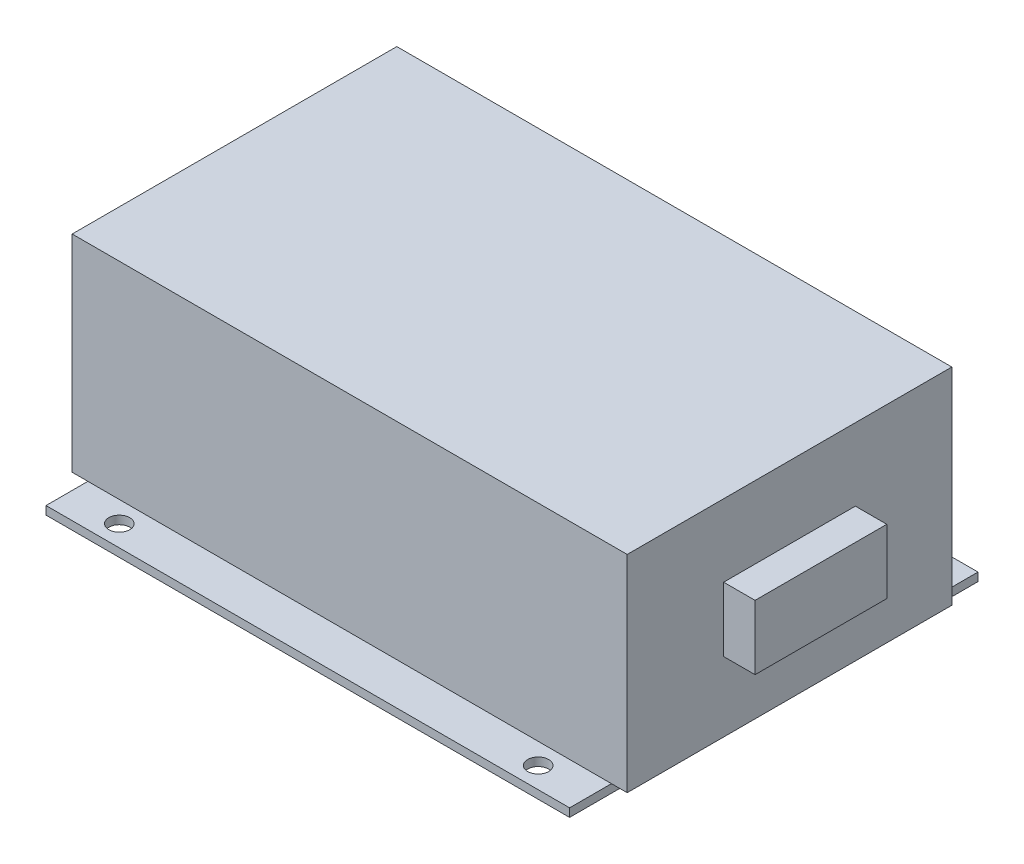
ISO-10303-21;
HEADER;
FILE_DESCRIPTION(('STEP AP214'),'2;1');
FILE_NAME('part.step','',(''),(''),'','','');
FILE_SCHEMA(('AUTOMOTIVE_DESIGN { 1 0 10303 214 1 1 1 1 }'));
ENDSEC;
DATA;
#1=APPLICATION_CONTEXT('core data for automotive mechanical design processes');
#2=APPLICATION_PROTOCOL_DEFINITION('international standard','automotive_design',2000,#1);
#3=PRODUCT_CONTEXT('',#1,'mechanical');
#4=PRODUCT('Part','Part','',(#3));
#5=PRODUCT_RELATED_PRODUCT_CATEGORY('part','',(#4));
#6=PRODUCT_DEFINITION_FORMATION('','',#4);
#7=PRODUCT_DEFINITION_CONTEXT('part definition',#1,'design');
#8=PRODUCT_DEFINITION('design','',#6,#7);
#9=PRODUCT_DEFINITION_SHAPE('','',#8);
#10=(LENGTH_UNIT() NAMED_UNIT(*) SI_UNIT(.MILLI.,.METRE.));
#11=(NAMED_UNIT(*) PLANE_ANGLE_UNIT() SI_UNIT($,.RADIAN.));
#12=(NAMED_UNIT(*) SI_UNIT($,.STERADIAN.) SOLID_ANGLE_UNIT());
#13=UNCERTAINTY_MEASURE_WITH_UNIT(LENGTH_MEASURE(1.E-05),#10,'distance_accuracy_value','');
#14=(GEOMETRIC_REPRESENTATION_CONTEXT(3) GLOBAL_UNCERTAINTY_ASSIGNED_CONTEXT((#13)) GLOBAL_UNIT_ASSIGNED_CONTEXT((#10,
#11,#12)) REPRESENTATION_CONTEXT('',''));
#15=CARTESIAN_POINT('',(0.,0.,0.));
#16=DIRECTION('',(0.,0.,1.));
#17=DIRECTION('',(1.,0.,0.));
#18=AXIS2_PLACEMENT_3D('',#15,#16,#17);
#19=CARTESIAN_POINT('',(53.,41.,31.));
#20=DIRECTION('',(-1.,0.,0.));
#21=DIRECTION('',(0.,0.,1.));
#22=AXIS2_PLACEMENT_3D('',#19,#20,#21);
#23=PLANE('',#22);
#24=DIRECTION('',(0.,0.,-1.));
#25=VECTOR('',#24,1.);
#26=CARTESIAN_POINT('',(53.,1.5875,31.));
#27=LINE('',#26,#25);
#28=CARTESIAN_POINT('',(53.,1.5875,31.));
#29=VERTEX_POINT('',#28);
#30=CARTESIAN_POINT('',(53.,1.5875,-31.));
#31=VERTEX_POINT('',#30);
#32=EDGE_CURVE('E158',#29,#31,#27,.T.);
#33=ORIENTED_EDGE('',*,*,#32,.T.);
#34=DIRECTION('',(0.,-1.,0.));
#35=VECTOR('',#34,1.);
#36=CARTESIAN_POINT('',(53.,41.,-31.));
#37=LINE('',#36,#35);
#38=CARTESIAN_POINT('',(53.,41.,-31.));
#39=VERTEX_POINT('',#38);
#40=EDGE_CURVE('E191',#39,#31,#37,.T.);
#41=ORIENTED_EDGE('',*,*,#40,.F.);
#42=DIRECTION('',(0.,0.,-1.));
#43=VECTOR('',#42,1.);
#44=CARTESIAN_POINT('',(53.,41.,31.));
#45=LINE('',#44,#43);
#46=CARTESIAN_POINT('',(53.,41.,31.));
#47=VERTEX_POINT('',#46);
#48=EDGE_CURVE('E167',#47,#39,#45,.T.);
#49=ORIENTED_EDGE('',*,*,#48,.F.);
#50=DIRECTION('',(0.,-1.,0.));
#51=VECTOR('',#50,1.);
#52=CARTESIAN_POINT('',(53.,41.,31.));
#53=LINE('',#52,#51);
#54=EDGE_CURVE('E175',#47,#29,#53,.T.);
#55=ORIENTED_EDGE('',*,*,#54,.T.);
#56=EDGE_LOOP('',(#33,#41,#49,#55));
#57=FACE_BOUND('',#56,.T.);
#58=DIRECTION('',(0.,1.,0.));
#59=VECTOR('',#58,1.);
#60=CARTESIAN_POINT('',(53.,27.1966098946059,-12.5784051962068));
#61=LINE('',#60,#59);
#62=CARTESIAN_POINT('',(53.,14.8999110587518,-12.5784051962068));
#63=VERTEX_POINT('',#62);
#64=CARTESIAN_POINT('',(53.,27.1966098946059,-12.5784051962068));
#65=VERTEX_POINT('',#64);
#66=EDGE_CURVE('E157',#63,#65,#61,.T.);
#67=ORIENTED_EDGE('',*,*,#66,.F.);
#68=DIRECTION('',(0.,0.,-1.));
#69=VECTOR('',#68,1.);
#70=CARTESIAN_POINT('',(53.,14.8999110587518,12.5784051962068));
#71=LINE('',#70,#69);
#72=CARTESIAN_POINT('',(53.,14.8999110587518,12.5784051962068));
#73=VERTEX_POINT('',#72);
#74=EDGE_CURVE('E154',#73,#63,#71,.T.);
#75=ORIENTED_EDGE('',*,*,#74,.F.);
#76=DIRECTION('',(0.,-1.,0.));
#77=VECTOR('',#76,1.);
#78=CARTESIAN_POINT('',(53.,27.1966098946059,12.5784051962068));
#79=LINE('',#78,#77);
#80=CARTESIAN_POINT('',(53.,27.1966098946059,12.5784051962068));
#81=VERTEX_POINT('',#80);
#82=EDGE_CURVE('E56',#81,#73,#79,.T.);
#83=ORIENTED_EDGE('',*,*,#82,.F.);
#84=DIRECTION('',(0.,0.,1.));
#85=VECTOR('',#84,1.);
#86=CARTESIAN_POINT('',(53.,27.1966098946059,12.5784051962068));
#87=LINE('',#86,#85);
#88=EDGE_CURVE('E51',#65,#81,#87,.T.);
#89=ORIENTED_EDGE('',*,*,#88,.F.);
#90=EDGE_LOOP('',(#67,#75,#83,#89));
#91=FACE_BOUND('',#90,.T.);
#92=ADVANCED_FACE('F32',(#57,#91),#23,.F.);
#93=CARTESIAN_POINT('',(50.,1.5875,-39.));
#94=DIRECTION('',(0.,-1.,0.));
#95=DIRECTION('',(0.,0.,-1.));
#96=AXIS2_PLACEMENT_3D('',#93,#94,#95);
#97=PLANE('',#96);
#98=CARTESIAN_POINT('',(40.,1.5875,35.));
#99=DIRECTION('',(0.,1.,0.));
#100=DIRECTION('',(0.,0.,1.));
#101=AXIS2_PLACEMENT_3D('',#98,#99,#100);
#102=CIRCLE('',#101,2.);
#103=CARTESIAN_POINT('',(40.,1.5875,37.));
#104=VERTEX_POINT('',#103);
#105=EDGE_CURVE('E195',#104,#104,#102,.T.);
#106=ORIENTED_EDGE('',*,*,#105,.F.);
#107=EDGE_LOOP('',(#106));
#108=FACE_BOUND('',#107,.T.);
#109=CARTESIAN_POINT('',(-40.,1.5875,35.));
#110=DIRECTION('',(0.,1.,0.));
#111=DIRECTION('',(0.,0.,1.));
#112=AXIS2_PLACEMENT_3D('',#109,#110,#111);
#113=CIRCLE('',#112,2.);
#114=CARTESIAN_POINT('',(-40.,1.5875,37.));
#115=VERTEX_POINT('',#114);
#116=EDGE_CURVE('E201',#115,#115,#113,.T.);
#117=ORIENTED_EDGE('',*,*,#116,.F.);
#118=EDGE_LOOP('',(#117));
#119=FACE_BOUND('',#118,.T.);
#120=DIRECTION('',(1.,0.,0.));
#121=VECTOR('',#120,1.);
#122=CARTESIAN_POINT('',(-53.,1.5875,31.));
#123=LINE('',#122,#121);
#124=CARTESIAN_POINT('',(-50.,1.5875,31.));
#125=VERTEX_POINT('',#124);
#126=CARTESIAN_POINT('',(50.,1.5875,31.));
#127=VERTEX_POINT('',#126);
#128=EDGE_CURVE('E11',#125,#127,#123,.T.);
#129=ORIENTED_EDGE('',*,*,#128,.F.);
#130=DIRECTION('',(0.,0.,1.));
#131=VECTOR('',#130,1.);
#132=CARTESIAN_POINT('',(-50.,1.5875,39.));
#133=LINE('',#132,#131);
#134=CARTESIAN_POINT('',(-50.,1.5875,39.));
#135=VERTEX_POINT('',#134);
#136=EDGE_CURVE('E226',#125,#135,#133,.T.);
#137=ORIENTED_EDGE('',*,*,#136,.T.);
#138=DIRECTION('',(1.,0.,0.));
#139=VECTOR('',#138,1.);
#140=CARTESIAN_POINT('',(-50.,1.5875,39.));
#141=LINE('',#140,#139);
#142=CARTESIAN_POINT('',(50.,1.5875,39.));
#143=VERTEX_POINT('',#142);
#144=EDGE_CURVE('E229',#135,#143,#141,.T.);
#145=ORIENTED_EDGE('',*,*,#144,.T.);
#146=DIRECTION('',(0.,0.,-1.));
#147=VECTOR('',#146,1.);
#148=CARTESIAN_POINT('',(50.,1.5875,39.));
#149=LINE('',#148,#147);
#150=EDGE_CURVE('E219',#143,#127,#149,.T.);
#151=ORIENTED_EDGE('',*,*,#150,.T.);
#152=EDGE_LOOP('',(#129,#137,#145,#151));
#153=FACE_BOUND('',#152,.T.);
#154=ADVANCED_FACE('F303',(#108,#119,#153),#97,.F.);
#155=CARTESIAN_POINT('',(40.,1.5875,-35.));
#156=DIRECTION('',(0.,1.,0.));
#157=DIRECTION('',(0.,0.,1.));
#158=AXIS2_PLACEMENT_3D('',#155,#156,#157);
#159=CIRCLE('',#158,2.);
#160=CARTESIAN_POINT('',(40.,1.5875,-33.));
#161=VERTEX_POINT('',#160);
#162=EDGE_CURVE('E207',#161,#161,#159,.T.);
#163=ORIENTED_EDGE('',*,*,#162,.F.);
#164=EDGE_LOOP('',(#163));
#165=FACE_BOUND('',#164,.T.);
#166=CARTESIAN_POINT('',(-40.,1.5875,-35.));
#167=DIRECTION('',(0.,1.,0.));
#168=DIRECTION('',(0.,0.,1.));
#169=AXIS2_PLACEMENT_3D('',#166,#167,#168);
#170=CIRCLE('',#169,2.);
#171=CARTESIAN_POINT('',(-40.,1.5875,-33.));
#172=VERTEX_POINT('',#171);
#173=EDGE_CURVE('E213',#172,#172,#170,.T.);
#174=ORIENTED_EDGE('',*,*,#173,.F.);
#175=EDGE_LOOP('',(#174));
#176=FACE_BOUND('',#175,.T.);
#177=DIRECTION('',(-1.,0.,0.));
#178=VECTOR('',#177,1.);
#179=CARTESIAN_POINT('',(-53.,1.5875,-31.));
#180=LINE('',#179,#178);
#181=CARTESIAN_POINT('',(50.,1.5875,-31.));
#182=VERTEX_POINT('',#181);
#183=CARTESIAN_POINT('',(-50.,1.5875,-31.));
#184=VERTEX_POINT('',#183);
#185=EDGE_CURVE('E41',#182,#184,#180,.T.);
#186=ORIENTED_EDGE('',*,*,#185,.F.);
#187=CARTESIAN_POINT('',(50.,1.5875,-39.));
#188=VERTEX_POINT('',#187);
#189=EDGE_CURVE('E224',#182,#188,#149,.T.);
#190=ORIENTED_EDGE('',*,*,#189,.T.);
#191=DIRECTION('',(-1.,0.,0.));
#192=VECTOR('',#191,1.);
#193=CARTESIAN_POINT('',(-50.,1.5875,-39.));
#194=LINE('',#193,#192);
#195=CARTESIAN_POINT('',(-50.,1.5875,-39.));
#196=VERTEX_POINT('',#195);
#197=EDGE_CURVE('E222',#188,#196,#194,.T.);
#198=ORIENTED_EDGE('',*,*,#197,.T.);
#199=EDGE_CURVE('E227',#196,#184,#133,.T.);
#200=ORIENTED_EDGE('',*,*,#199,.T.);
#201=EDGE_LOOP('',(#186,#190,#198,#200));
#202=FACE_BOUND('',#201,.T.);
#203=ADVANCED_FACE('F288',(#165,#176,#202),#97,.F.);
#204=CARTESIAN_POINT('',(50.,0.,-39.));
#205=DIRECTION('',(0.,-1.,0.));
#206=DIRECTION('',(0.,0.,-1.));
#207=AXIS2_PLACEMENT_3D('',#204,#205,#206);
#208=PLANE('',#207);
#209=CARTESIAN_POINT('',(-40.,0.,35.));
#210=DIRECTION('',(0.,1.,0.));
#211=DIRECTION('',(0.,0.,1.));
#212=AXIS2_PLACEMENT_3D('',#209,#210,#211);
#213=CIRCLE('',#212,2.);
#214=CARTESIAN_POINT('',(-40.,0.,37.));
#215=VERTEX_POINT('',#214);
#216=EDGE_CURVE('E198',#215,#215,#213,.T.);
#217=ORIENTED_EDGE('',*,*,#216,.T.);
#218=EDGE_LOOP('',(#217));
#219=FACE_BOUND('',#218,.T.);
#220=CARTESIAN_POINT('',(-40.,0.,-35.));
#221=DIRECTION('',(0.,1.,0.));
#222=DIRECTION('',(0.,0.,1.));
#223=AXIS2_PLACEMENT_3D('',#220,#221,#222);
#224=CIRCLE('',#223,2.);
#225=CARTESIAN_POINT('',(-40.,0.,-33.));
#226=VERTEX_POINT('',#225);
#227=EDGE_CURVE('E210',#226,#226,#224,.T.);
#228=ORIENTED_EDGE('',*,*,#227,.T.);
#229=EDGE_LOOP('',(#228));
#230=FACE_BOUND('',#229,.T.);
#231=DIRECTION('',(0.,0.,-1.));
#232=VECTOR('',#231,1.);
#233=CARTESIAN_POINT('',(50.,0.,39.));
#234=LINE('',#233,#232);
#235=CARTESIAN_POINT('',(50.,0.,39.));
#236=VERTEX_POINT('',#235);
#237=CARTESIAN_POINT('',(50.,0.,-39.));
#238=VERTEX_POINT('',#237);
#239=EDGE_CURVE('E216',#236,#238,#234,.T.);
#240=ORIENTED_EDGE('',*,*,#239,.F.);
#241=DIRECTION('',(1.,0.,0.));
#242=VECTOR('',#241,1.);
#243=CARTESIAN_POINT('',(-50.,0.,39.));
#244=LINE('',#243,#242);
#245=CARTESIAN_POINT('',(-50.,0.,39.));
#246=VERTEX_POINT('',#245);
#247=EDGE_CURVE('E239',#246,#236,#244,.T.);
#248=ORIENTED_EDGE('',*,*,#247,.F.);
#249=DIRECTION('',(0.,0.,1.));
#250=VECTOR('',#249,1.);
#251=CARTESIAN_POINT('',(-50.,0.,39.));
#252=LINE('',#251,#250);
#253=CARTESIAN_POINT('',(-50.,0.,-39.));
#254=VERTEX_POINT('',#253);
#255=EDGE_CURVE('E237',#254,#246,#252,.T.);
#256=ORIENTED_EDGE('',*,*,#255,.F.);
#257=DIRECTION('',(-1.,0.,0.));
#258=VECTOR('',#257,1.);
#259=CARTESIAN_POINT('',(-50.,0.,-39.));
#260=LINE('',#259,#258);
#261=EDGE_CURVE('E235',#238,#254,#260,.T.);
#262=ORIENTED_EDGE('',*,*,#261,.F.);
#263=EDGE_LOOP('',(#240,#248,#256,#262));
#264=FACE_BOUND('',#263,.T.);
#265=CARTESIAN_POINT('',(40.,0.,-35.));
#266=DIRECTION('',(0.,1.,0.));
#267=DIRECTION('',(0.,0.,1.));
#268=AXIS2_PLACEMENT_3D('',#265,#266,#267);
#269=CIRCLE('',#268,2.);
#270=CARTESIAN_POINT('',(40.,0.,-33.));
#271=VERTEX_POINT('',#270);
#272=EDGE_CURVE('E204',#271,#271,#269,.T.);
#273=ORIENTED_EDGE('',*,*,#272,.T.);
#274=EDGE_LOOP('',(#273));
#275=FACE_BOUND('',#274,.T.);
#276=CARTESIAN_POINT('',(40.,0.,35.));
#277=DIRECTION('',(0.,1.,0.));
#278=DIRECTION('',(0.,0.,1.));
#279=AXIS2_PLACEMENT_3D('',#276,#277,#278);
#280=CIRCLE('',#279,2.);
#281=CARTESIAN_POINT('',(40.,0.,37.));
#282=VERTEX_POINT('',#281);
#283=EDGE_CURVE('E194',#282,#282,#280,.T.);
#284=ORIENTED_EDGE('',*,*,#283,.T.);
#285=EDGE_LOOP('',(#284));
#286=FACE_BOUND('',#285,.T.);
#287=ADVANCED_FACE('F294',(#219,#230,#264,#275,#286),#208,.T.);
#288=CARTESIAN_POINT('',(50.,1.5875,39.));
#289=DIRECTION('',(-1.,0.,0.));
#290=DIRECTION('',(0.,0.,1.));
#291=AXIS2_PLACEMENT_3D('',#288,#289,#290);
#292=PLANE('',#291);
#293=ORIENTED_EDGE('',*,*,#239,.T.);
#294=DIRECTION('',(0.,-1.,0.));
#295=VECTOR('',#294,1.);
#296=CARTESIAN_POINT('',(50.,1.5875,-39.));
#297=LINE('',#296,#295);
#298=EDGE_CURVE('E36',#188,#238,#297,.T.);
#299=ORIENTED_EDGE('',*,*,#298,.F.);
#300=ORIENTED_EDGE('',*,*,#189,.F.);
#301=EDGE_CURVE('E223',#127,#182,#149,.T.);
#302=ORIENTED_EDGE('',*,*,#301,.F.);
#303=ORIENTED_EDGE('',*,*,#150,.F.);
#304=DIRECTION('',(0.,-1.,0.));
#305=VECTOR('',#304,1.);
#306=CARTESIAN_POINT('',(50.,1.5875,39.));
#307=LINE('',#306,#305);
#308=EDGE_CURVE('E232',#143,#236,#307,.T.);
#309=ORIENTED_EDGE('',*,*,#308,.T.);
#310=EDGE_LOOP('',(#293,#299,#300,#302,#303,#309));
#311=FACE_BOUND('',#310,.T.);
#312=ADVANCED_FACE('F34',(#311),#292,.F.);
#313=CARTESIAN_POINT('',(-50.,1.5875,-39.));
#314=DIRECTION('',(0.,0.,1.));
#315=DIRECTION('',(1.,0.,0.));
#316=AXIS2_PLACEMENT_3D('',#313,#314,#315);
#317=PLANE('',#316);
#318=ORIENTED_EDGE('',*,*,#261,.T.);
#319=DIRECTION('',(0.,-1.,0.));
#320=VECTOR('',#319,1.);
#321=CARTESIAN_POINT('',(-50.,1.5875,-39.));
#322=LINE('',#321,#320);
#323=EDGE_CURVE('E245',#196,#254,#322,.T.);
#324=ORIENTED_EDGE('',*,*,#323,.F.);
#325=ORIENTED_EDGE('',*,*,#197,.F.);
#326=ORIENTED_EDGE('',*,*,#298,.T.);
#327=EDGE_LOOP('',(#318,#324,#325,#326));
#328=FACE_BOUND('',#327,.T.);
#329=ADVANCED_FACE('F289',(#328),#317,.F.);
#330=CARTESIAN_POINT('',(-50.,1.5875,39.));
#331=DIRECTION('',(1.,0.,0.));
#332=DIRECTION('',(0.,0.,-1.));
#333=AXIS2_PLACEMENT_3D('',#330,#331,#332);
#334=PLANE('',#333);
#335=ORIENTED_EDGE('',*,*,#255,.T.);
#336=DIRECTION('',(0.,-1.,0.));
#337=VECTOR('',#336,1.);
#338=CARTESIAN_POINT('',(-50.,1.5875,39.));
#339=LINE('',#338,#337);
#340=EDGE_CURVE('E243',#135,#246,#339,.T.);
#341=ORIENTED_EDGE('',*,*,#340,.F.);
#342=ORIENTED_EDGE('',*,*,#136,.F.);
#343=EDGE_CURVE('E230',#184,#125,#133,.T.);
#344=ORIENTED_EDGE('',*,*,#343,.F.);
#345=ORIENTED_EDGE('',*,*,#199,.F.);
#346=ORIENTED_EDGE('',*,*,#323,.T.);
#347=EDGE_LOOP('',(#335,#341,#342,#344,#345,#346));
#348=FACE_BOUND('',#347,.T.);
#349=ADVANCED_FACE('F297',(#348),#334,.F.);
#350=CARTESIAN_POINT('',(-50.,1.5875,39.));
#351=DIRECTION('',(0.,0.,-1.));
#352=DIRECTION('',(-1.,0.,0.));
#353=AXIS2_PLACEMENT_3D('',#350,#351,#352);
#354=PLANE('',#353);
#355=ORIENTED_EDGE('',*,*,#247,.T.);
#356=ORIENTED_EDGE('',*,*,#308,.F.);
#357=ORIENTED_EDGE('',*,*,#144,.F.);
#358=ORIENTED_EDGE('',*,*,#340,.T.);
#359=EDGE_LOOP('',(#355,#356,#357,#358));
#360=FACE_BOUND('',#359,.T.);
#361=ADVANCED_FACE('F301',(#360),#354,.F.);
#362=CARTESIAN_POINT('',(-40.,1.5875,-35.));
#363=DIRECTION('',(0.,-1.,0.));
#364=DIRECTION('',(0.,0.,-1.));
#365=AXIS2_PLACEMENT_3D('',#362,#363,#364);
#366=CYLINDRICAL_SURFACE('',#365,2.);
#367=ORIENTED_EDGE('',*,*,#173,.T.);
#368=EDGE_LOOP('',(#367));
#369=FACE_BOUND('',#368,.T.);
#370=ORIENTED_EDGE('',*,*,#227,.F.);
#371=EDGE_LOOP('',(#370));
#372=FACE_BOUND('',#371,.T.);
#373=ADVANCED_FACE('F317',(#369,#372),#366,.F.);
#374=CARTESIAN_POINT('',(40.,1.5875,-35.));
#375=DIRECTION('',(0.,-1.,0.));
#376=DIRECTION('',(0.,0.,-1.));
#377=AXIS2_PLACEMENT_3D('',#374,#375,#376);
#378=CYLINDRICAL_SURFACE('',#377,2.);
#379=ORIENTED_EDGE('',*,*,#162,.T.);
#380=EDGE_LOOP('',(#379));
#381=FACE_BOUND('',#380,.T.);
#382=ORIENTED_EDGE('',*,*,#272,.F.);
#383=EDGE_LOOP('',(#382));
#384=FACE_BOUND('',#383,.T.);
#385=ADVANCED_FACE('F366',(#381,#384),#378,.F.);
#386=CARTESIAN_POINT('',(-40.,1.5875,35.));
#387=DIRECTION('',(0.,-1.,0.));
#388=DIRECTION('',(0.,0.,-1.));
#389=AXIS2_PLACEMENT_3D('',#386,#387,#388);
#390=CYLINDRICAL_SURFACE('',#389,2.);
#391=ORIENTED_EDGE('',*,*,#116,.T.);
#392=EDGE_LOOP('',(#391));
#393=FACE_BOUND('',#392,.T.);
#394=ORIENTED_EDGE('',*,*,#216,.F.);
#395=EDGE_LOOP('',(#394));
#396=FACE_BOUND('',#395,.T.);
#397=ADVANCED_FACE('F355',(#393,#396),#390,.F.);
#398=CARTESIAN_POINT('',(40.,1.5875,35.));
#399=DIRECTION('',(0.,-1.,0.));
#400=DIRECTION('',(0.,0.,-1.));
#401=AXIS2_PLACEMENT_3D('',#398,#399,#400);
#402=CYLINDRICAL_SURFACE('',#401,2.);
#403=ORIENTED_EDGE('',*,*,#105,.T.);
#404=EDGE_LOOP('',(#403));
#405=FACE_BOUND('',#404,.T.);
#406=ORIENTED_EDGE('',*,*,#283,.F.);
#407=EDGE_LOOP('',(#406));
#408=FACE_BOUND('',#407,.T.);
#409=ADVANCED_FACE('F351',(#405,#408),#402,.F.);
#410=CARTESIAN_POINT('',(53.,1.5875,-31.));
#411=DIRECTION('',(0.,-1.,0.));
#412=DIRECTION('',(0.,0.,-1.));
#413=AXIS2_PLACEMENT_3D('',#410,#411,#412);
#414=PLANE('',#413);
#415=EDGE_CURVE('E44',#127,#29,#123,.T.);
#416=ORIENTED_EDGE('',*,*,#415,.F.);
#417=ORIENTED_EDGE('',*,*,#301,.T.);
#418=EDGE_CURVE('E177',#31,#182,#180,.T.);
#419=ORIENTED_EDGE('',*,*,#418,.F.);
#420=ORIENTED_EDGE('',*,*,#32,.F.);
#421=EDGE_LOOP('',(#416,#417,#419,#420));
#422=FACE_BOUND('',#421,.T.);
#423=ADVANCED_FACE('F282',(#422),#414,.T.);
#424=CARTESIAN_POINT('',(-53.,41.,-31.));
#425=DIRECTION('',(0.,0.,1.));
#426=DIRECTION('',(1.,0.,0.));
#427=AXIS2_PLACEMENT_3D('',#424,#425,#426);
#428=PLANE('',#427);
#429=ORIENTED_EDGE('',*,*,#418,.T.);
#430=ORIENTED_EDGE('',*,*,#185,.T.);
#431=CARTESIAN_POINT('',(-53.,1.5875,-31.));
#432=VERTEX_POINT('',#431);
#433=EDGE_CURVE('E161',#184,#432,#180,.T.);
#434=ORIENTED_EDGE('',*,*,#433,.T.);
#435=DIRECTION('',(0.,-1.,0.));
#436=VECTOR('',#435,1.);
#437=CARTESIAN_POINT('',(-53.,41.,-31.));
#438=LINE('',#437,#436);
#439=CARTESIAN_POINT('',(-53.,41.,-31.));
#440=VERTEX_POINT('',#439);
#441=EDGE_CURVE('E188',#440,#432,#438,.T.);
#442=ORIENTED_EDGE('',*,*,#441,.F.);
#443=DIRECTION('',(-1.,0.,0.));
#444=VECTOR('',#443,1.);
#445=CARTESIAN_POINT('',(-53.,41.,-31.));
#446=LINE('',#445,#444);
#447=EDGE_CURVE('E170',#39,#440,#446,.T.);
#448=ORIENTED_EDGE('',*,*,#447,.F.);
#449=ORIENTED_EDGE('',*,*,#40,.T.);
#450=EDGE_LOOP('',(#429,#430,#434,#442,#448,#449));
#451=FACE_BOUND('',#450,.T.);
#452=ADVANCED_FACE('F259',(#451),#428,.F.);
#453=CARTESIAN_POINT('',(-53.,41.,31.));
#454=DIRECTION('',(1.,0.,0.));
#455=DIRECTION('',(0.,0.,-1.));
#456=AXIS2_PLACEMENT_3D('',#453,#454,#455);
#457=PLANE('',#456);
#458=DIRECTION('',(0.,0.,1.));
#459=VECTOR('',#458,1.);
#460=CARTESIAN_POINT('',(-53.,1.5875,31.));
#461=LINE('',#460,#459);
#462=CARTESIAN_POINT('',(-53.,1.5875,31.));
#463=VERTEX_POINT('',#462);
#464=EDGE_CURVE('E180',#432,#463,#461,.T.);
#465=ORIENTED_EDGE('',*,*,#464,.T.);
#466=DIRECTION('',(0.,-1.,0.));
#467=VECTOR('',#466,1.);
#468=CARTESIAN_POINT('',(-53.,41.,31.));
#469=LINE('',#468,#467);
#470=CARTESIAN_POINT('',(-53.,41.,31.));
#471=VERTEX_POINT('',#470);
#472=EDGE_CURVE('E185',#471,#463,#469,.T.);
#473=ORIENTED_EDGE('',*,*,#472,.F.);
#474=DIRECTION('',(0.,0.,1.));
#475=VECTOR('',#474,1.);
#476=CARTESIAN_POINT('',(-53.,41.,31.));
#477=LINE('',#476,#475);
#478=EDGE_CURVE('E172',#440,#471,#477,.T.);
#479=ORIENTED_EDGE('',*,*,#478,.F.);
#480=ORIENTED_EDGE('',*,*,#441,.T.);
#481=EDGE_LOOP('',(#465,#473,#479,#480));
#482=FACE_BOUND('',#481,.T.);
#483=ADVANCED_FACE('F265',(#482),#457,.F.);
#484=CARTESIAN_POINT('',(-53.,41.,31.));
#485=DIRECTION('',(0.,0.,-1.));
#486=DIRECTION('',(-1.,0.,0.));
#487=AXIS2_PLACEMENT_3D('',#484,#485,#486);
#488=PLANE('',#487);
#489=EDGE_CURVE('E43',#463,#125,#123,.T.);
#490=ORIENTED_EDGE('',*,*,#489,.T.);
#491=ORIENTED_EDGE('',*,*,#128,.T.);
#492=ORIENTED_EDGE('',*,*,#415,.T.);
#493=ORIENTED_EDGE('',*,*,#54,.F.);
#494=DIRECTION('',(1.,0.,0.));
#495=VECTOR('',#494,1.);
#496=CARTESIAN_POINT('',(-53.,41.,31.));
#497=LINE('',#496,#495);
#498=EDGE_CURVE('E174',#471,#47,#497,.T.);
#499=ORIENTED_EDGE('',*,*,#498,.F.);
#500=ORIENTED_EDGE('',*,*,#472,.T.);
#501=EDGE_LOOP('',(#490,#491,#492,#493,#499,#500));
#502=FACE_BOUND('',#501,.T.);
#503=ADVANCED_FACE('F271',(#502),#488,.F.);
#504=CARTESIAN_POINT('',(53.,41.,-31.));
#505=DIRECTION('',(0.,-1.,0.));
#506=DIRECTION('',(0.,0.,-1.));
#507=AXIS2_PLACEMENT_3D('',#504,#505,#506);
#508=PLANE('',#507);
#509=ORIENTED_EDGE('',*,*,#48,.T.);
#510=ORIENTED_EDGE('',*,*,#447,.T.);
#511=ORIENTED_EDGE('',*,*,#478,.T.);
#512=ORIENTED_EDGE('',*,*,#498,.T.);
#513=EDGE_LOOP('',(#509,#510,#511,#512));
#514=FACE_BOUND('',#513,.T.);
#515=ADVANCED_FACE('F276',(#514),#508,.F.);
#516=ORIENTED_EDGE('',*,*,#433,.F.);
#517=ORIENTED_EDGE('',*,*,#343,.T.);
#518=ORIENTED_EDGE('',*,*,#489,.F.);
#519=ORIENTED_EDGE('',*,*,#464,.F.);
#520=EDGE_LOOP('',(#516,#517,#518,#519));
#521=FACE_BOUND('',#520,.T.);
#522=ADVANCED_FACE('F268',(#521),#414,.T.);
#523=CARTESIAN_POINT('',(59.,27.1966098946059,-12.5784051962068));
#524=DIRECTION('',(0.,0.,1.));
#525=DIRECTION('',(1.,0.,0.));
#526=AXIS2_PLACEMENT_3D('',#523,#524,#525);
#527=PLANE('',#526);
#528=ORIENTED_EDGE('',*,*,#66,.T.);
#529=DIRECTION('',(-1.,0.,0.));
#530=VECTOR('',#529,1.);
#531=CARTESIAN_POINT('',(59.,27.1966098946059,-12.5784051962068));
#532=LINE('',#531,#530);
#533=CARTESIAN_POINT('',(59.,27.1966098946059,-12.5784051962068));
#534=VERTEX_POINT('',#533);
#535=EDGE_CURVE('E138',#534,#65,#532,.T.);
#536=ORIENTED_EDGE('',*,*,#535,.F.);
#537=DIRECTION('',(0.,1.,0.));
#538=VECTOR('',#537,1.);
#539=CARTESIAN_POINT('',(59.,27.1966098946059,-12.5784051962068));
#540=LINE('',#539,#538);
#541=CARTESIAN_POINT('',(59.,14.8999110587518,-12.5784051962068));
#542=VERTEX_POINT('',#541);
#543=EDGE_CURVE('E145',#542,#534,#540,.T.);
#544=ORIENTED_EDGE('',*,*,#543,.F.);
#545=DIRECTION('',(-1.,0.,0.));
#546=VECTOR('',#545,1.);
#547=CARTESIAN_POINT('',(59.,14.8999110587518,-12.5784051962068));
#548=LINE('',#547,#546);
#549=EDGE_CURVE('E501',#542,#63,#548,.T.);
#550=ORIENTED_EDGE('',*,*,#549,.T.);
#551=EDGE_LOOP('',(#528,#536,#544,#550));
#552=FACE_BOUND('',#551,.T.);
#553=ADVANCED_FACE('F156',(#552),#527,.F.);
#554=CARTESIAN_POINT('',(59.,27.1966098946059,12.5784051962068));
#555=DIRECTION('',(0.,-1.,0.));
#556=DIRECTION('',(0.,0.,-1.));
#557=AXIS2_PLACEMENT_3D('',#554,#555,#556);
#558=PLANE('',#557);
#559=ORIENTED_EDGE('',*,*,#88,.T.);
#560=DIRECTION('',(-1.,0.,0.));
#561=VECTOR('',#560,1.);
#562=CARTESIAN_POINT('',(59.,27.1966098946059,12.5784051962068));
#563=LINE('',#562,#561);
#564=CARTESIAN_POINT('',(59.,27.1966098946059,12.5784051962068));
#565=VERTEX_POINT('',#564);
#566=EDGE_CURVE('E141',#565,#81,#563,.T.);
#567=ORIENTED_EDGE('',*,*,#566,.F.);
#568=DIRECTION('',(0.,0.,1.));
#569=VECTOR('',#568,1.);
#570=CARTESIAN_POINT('',(59.,27.1966098946059,12.5784051962068));
#571=LINE('',#570,#569);
#572=EDGE_CURVE('E134',#534,#565,#571,.T.);
#573=ORIENTED_EDGE('',*,*,#572,.F.);
#574=ORIENTED_EDGE('',*,*,#535,.T.);
#575=EDGE_LOOP('',(#559,#567,#573,#574));
#576=FACE_BOUND('',#575,.T.);
#577=ADVANCED_FACE('F136',(#576),#558,.F.);
#578=CARTESIAN_POINT('',(59.,27.1966098946059,12.5784051962068));
#579=DIRECTION('',(0.,0.,-1.));
#580=DIRECTION('',(-1.,0.,0.));
#581=AXIS2_PLACEMENT_3D('',#578,#579,#580);
#582=PLANE('',#581);
#583=ORIENTED_EDGE('',*,*,#82,.T.);
#584=DIRECTION('',(-1.,0.,0.));
#585=VECTOR('',#584,1.);
#586=CARTESIAN_POINT('',(59.,14.8999110587518,12.5784051962068));
#587=LINE('',#586,#585);
#588=CARTESIAN_POINT('',(59.,14.8999110587518,12.5784051962068));
#589=VERTEX_POINT('',#588);
#590=EDGE_CURVE('E163',#589,#73,#587,.T.);
#591=ORIENTED_EDGE('',*,*,#590,.F.);
#592=DIRECTION('',(0.,-1.,0.));
#593=VECTOR('',#592,1.);
#594=CARTESIAN_POINT('',(59.,27.1966098946059,12.5784051962068));
#595=LINE('',#594,#593);
#596=EDGE_CURVE('E144',#565,#589,#595,.T.);
#597=ORIENTED_EDGE('',*,*,#596,.F.);
#598=ORIENTED_EDGE('',*,*,#566,.T.);
#599=EDGE_LOOP('',(#583,#591,#597,#598));
#600=FACE_BOUND('',#599,.T.);
#601=ADVANCED_FACE('F468',(#600),#582,.F.);
#602=CARTESIAN_POINT('',(59.,14.8999110587518,12.5784051962068));
#603=DIRECTION('',(0.,1.,0.));
#604=DIRECTION('',(0.,0.,1.));
#605=AXIS2_PLACEMENT_3D('',#602,#603,#604);
#606=PLANE('',#605);
#607=ORIENTED_EDGE('',*,*,#74,.T.);
#608=ORIENTED_EDGE('',*,*,#549,.F.);
#609=DIRECTION('',(0.,0.,-1.));
#610=VECTOR('',#609,1.);
#611=CARTESIAN_POINT('',(59.,14.8999110587518,12.5784051962068));
#612=LINE('',#611,#610);
#613=EDGE_CURVE('E150',#589,#542,#612,.T.);
#614=ORIENTED_EDGE('',*,*,#613,.F.);
#615=ORIENTED_EDGE('',*,*,#590,.T.);
#616=EDGE_LOOP('',(#607,#608,#614,#615));
#617=FACE_BOUND('',#616,.T.);
#618=ADVANCED_FACE('F477',(#617),#606,.F.);
#619=CARTESIAN_POINT('',(59.,14.8999110587518,-12.5784051962068));
#620=DIRECTION('',(1.,0.,0.));
#621=DIRECTION('',(0.,0.,-1.));
#622=AXIS2_PLACEMENT_3D('',#619,#620,#621);
#623=PLANE('',#622);
#624=ORIENTED_EDGE('',*,*,#543,.T.);
#625=ORIENTED_EDGE('',*,*,#572,.T.);
#626=ORIENTED_EDGE('',*,*,#596,.T.);
#627=ORIENTED_EDGE('',*,*,#613,.T.);
#628=EDGE_LOOP('',(#624,#625,#626,#627));
#629=FACE_BOUND('',#628,.T.);
#630=ADVANCED_FACE('F148',(#629),#623,.T.);
#631=CLOSED_SHELL('',(#92,#154,#203,#287,#312,#329,#349,#361,#373,#385,#397,#409,#423,#452,#483,
#503,#515,#522,#553,#577,#601,#618,#630));
#632=MANIFOLD_SOLID_BREP('B2',#631);
#633=ADVANCED_BREP_SHAPE_REPRESENTATION('',(#18,#632),#14);
#634=SHAPE_DEFINITION_REPRESENTATION(#9,#633);
ENDSEC;
END-ISO-10303-21;
